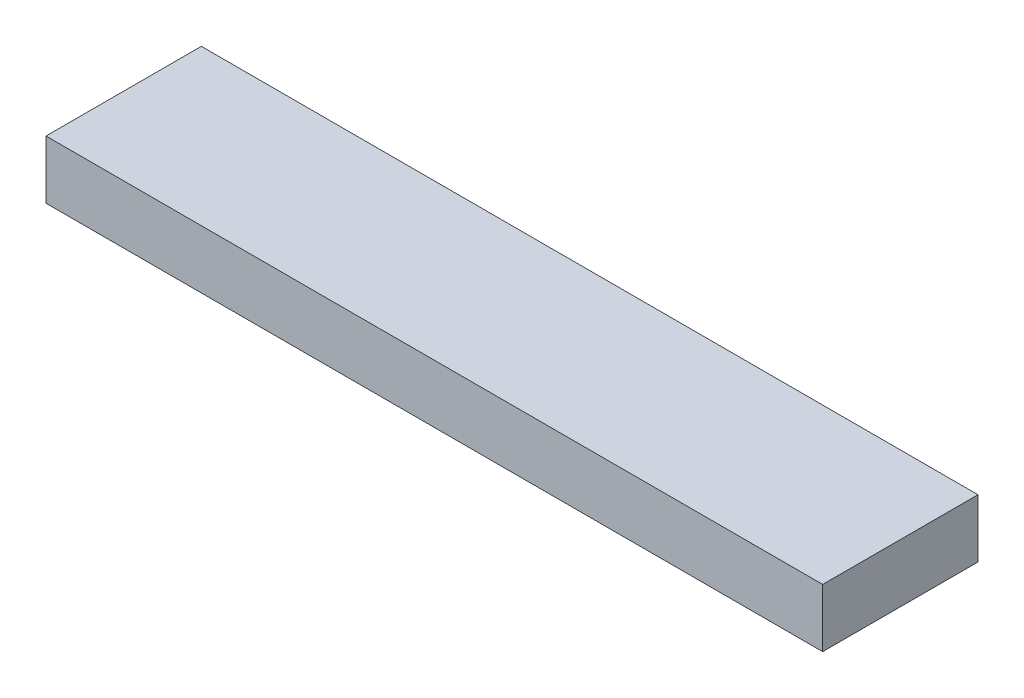
ISO-10303-21;
HEADER;
FILE_DESCRIPTION(('STEP AP214'),'2;1');
FILE_NAME('part.step','',(''),(''),'','','');
FILE_SCHEMA(('AUTOMOTIVE_DESIGN { 1 0 10303 214 1 1 1 1 }'));
ENDSEC;
DATA;
#1=APPLICATION_CONTEXT('core data for automotive mechanical design processes');
#2=APPLICATION_PROTOCOL_DEFINITION('international standard','automotive_design',2000,#1);
#3=PRODUCT_CONTEXT('',#1,'mechanical');
#4=PRODUCT('Part','Part','',(#3));
#5=PRODUCT_RELATED_PRODUCT_CATEGORY('part','',(#4));
#6=PRODUCT_DEFINITION_FORMATION('','',#4);
#7=PRODUCT_DEFINITION_CONTEXT('part definition',#1,'design');
#8=PRODUCT_DEFINITION('design','',#6,#7);
#9=PRODUCT_DEFINITION_SHAPE('','',#8);
#10=(LENGTH_UNIT() NAMED_UNIT(*) SI_UNIT(.MILLI.,.METRE.));
#11=(NAMED_UNIT(*) PLANE_ANGLE_UNIT() SI_UNIT($,.RADIAN.));
#12=(NAMED_UNIT(*) SI_UNIT($,.STERADIAN.) SOLID_ANGLE_UNIT());
#13=UNCERTAINTY_MEASURE_WITH_UNIT(LENGTH_MEASURE(1.E-05),#10,'distance_accuracy_value','');
#14=(GEOMETRIC_REPRESENTATION_CONTEXT(3) GLOBAL_UNCERTAINTY_ASSIGNED_CONTEXT((#13)) GLOBAL_UNIT_ASSIGNED_CONTEXT((#10,
#11,#12)) REPRESENTATION_CONTEXT('',''));
#15=CARTESIAN_POINT('',(0.,0.,0.));
#16=DIRECTION('',(0.,0.,1.));
#17=DIRECTION('',(1.,0.,0.));
#18=AXIS2_PLACEMENT_3D('',#15,#16,#17);
#19=CARTESIAN_POINT('',(-20.,3.,4.));
#20=DIRECTION('',(1.,0.,0.));
#21=DIRECTION('',(0.,0.,-1.));
#22=AXIS2_PLACEMENT_3D('',#19,#20,#21);
#23=PLANE('',#22);
#24=DIRECTION('',(0.,0.,1.));
#25=VECTOR('',#24,1.);
#26=CARTESIAN_POINT('',(-20.,0.,4.));
#27=LINE('',#26,#25);
#28=CARTESIAN_POINT('',(-20.,0.,-4.));
#29=VERTEX_POINT('',#28);
#30=CARTESIAN_POINT('',(-20.,0.,4.));
#31=VERTEX_POINT('',#30);
#32=EDGE_CURVE('E111',#29,#31,#27,.T.);
#33=ORIENTED_EDGE('',*,*,#32,.T.);
#34=DIRECTION('',(0.,-1.,0.));
#35=VECTOR('',#34,1.);
#36=CARTESIAN_POINT('',(-20.,3.,4.));
#37=LINE('',#36,#35);
#38=CARTESIAN_POINT('',(-20.,3.,4.));
#39=VERTEX_POINT('',#38);
#40=EDGE_CURVE('E11',#39,#31,#37,.T.);
#41=ORIENTED_EDGE('',*,*,#40,.F.);
#42=DIRECTION('',(0.,0.,1.));
#43=VECTOR('',#42,1.);
#44=CARTESIAN_POINT('',(-20.,3.,4.));
#45=LINE('',#44,#43);
#46=CARTESIAN_POINT('',(-20.,3.,-4.));
#47=VERTEX_POINT('',#46);
#48=EDGE_CURVE('E95',#47,#39,#45,.T.);
#49=ORIENTED_EDGE('',*,*,#48,.F.);
#50=DIRECTION('',(0.,-1.,0.));
#51=VECTOR('',#50,1.);
#52=CARTESIAN_POINT('',(-20.,3.,-4.));
#53=LINE('',#52,#51);
#54=EDGE_CURVE('E107',#47,#29,#53,.T.);
#55=ORIENTED_EDGE('',*,*,#54,.T.);
#56=EDGE_LOOP('',(#33,#41,#49,#55));
#57=FACE_BOUND('',#56,.T.);
#58=ADVANCED_FACE('F43',(#57),#23,.F.);
#59=CARTESIAN_POINT('',(20.,3.,4.));
#60=DIRECTION('',(0.,0.,-1.));
#61=DIRECTION('',(-1.,0.,0.));
#62=AXIS2_PLACEMENT_3D('',#59,#60,#61);
#63=PLANE('',#62);
#64=DIRECTION('',(1.,0.,0.));
#65=VECTOR('',#64,1.);
#66=CARTESIAN_POINT('',(20.,0.,4.));
#67=LINE('',#66,#65);
#68=CARTESIAN_POINT('',(20.,0.,4.));
#69=VERTEX_POINT('',#68);
#70=EDGE_CURVE('E100',#31,#69,#67,.T.);
#71=ORIENTED_EDGE('',*,*,#70,.T.);
#72=DIRECTION('',(0.,-1.,0.));
#73=VECTOR('',#72,1.);
#74=CARTESIAN_POINT('',(20.,3.,4.));
#75=LINE('',#74,#73);
#76=CARTESIAN_POINT('',(20.,3.,4.));
#77=VERTEX_POINT('',#76);
#78=EDGE_CURVE('E52',#77,#69,#75,.T.);
#79=ORIENTED_EDGE('',*,*,#78,.F.);
#80=DIRECTION('',(1.,0.,0.));
#81=VECTOR('',#80,1.);
#82=CARTESIAN_POINT('',(20.,3.,4.));
#83=LINE('',#82,#81);
#84=EDGE_CURVE('E90',#39,#77,#83,.T.);
#85=ORIENTED_EDGE('',*,*,#84,.F.);
#86=ORIENTED_EDGE('',*,*,#40,.T.);
#87=EDGE_LOOP('',(#71,#79,#85,#86));
#88=FACE_BOUND('',#87,.T.);
#89=ADVANCED_FACE('F99',(#88),#63,.F.);
#90=CARTESIAN_POINT('',(20.,3.,4.));
#91=DIRECTION('',(-1.,0.,0.));
#92=DIRECTION('',(0.,0.,1.));
#93=AXIS2_PLACEMENT_3D('',#90,#91,#92);
#94=PLANE('',#93);
#95=DIRECTION('',(0.,0.,-1.));
#96=VECTOR('',#95,1.);
#97=CARTESIAN_POINT('',(20.,0.,4.));
#98=LINE('',#97,#96);
#99=CARTESIAN_POINT('',(20.,0.,-4.));
#100=VERTEX_POINT('',#99);
#101=EDGE_CURVE('E77',#69,#100,#98,.T.);
#102=ORIENTED_EDGE('',*,*,#101,.T.);
#103=DIRECTION('',(0.,-1.,0.));
#104=VECTOR('',#103,1.);
#105=CARTESIAN_POINT('',(20.,3.,-4.));
#106=LINE('',#105,#104);
#107=CARTESIAN_POINT('',(20.,3.,-4.));
#108=VERTEX_POINT('',#107);
#109=EDGE_CURVE('E102',#108,#100,#106,.T.);
#110=ORIENTED_EDGE('',*,*,#109,.F.);
#111=DIRECTION('',(0.,0.,-1.));
#112=VECTOR('',#111,1.);
#113=CARTESIAN_POINT('',(20.,3.,4.));
#114=LINE('',#113,#112);
#115=EDGE_CURVE('E93',#77,#108,#114,.T.);
#116=ORIENTED_EDGE('',*,*,#115,.F.);
#117=ORIENTED_EDGE('',*,*,#78,.T.);
#118=EDGE_LOOP('',(#102,#110,#116,#117));
#119=FACE_BOUND('',#118,.T.);
#120=ADVANCED_FACE('F103',(#119),#94,.F.);
#121=CARTESIAN_POINT('',(20.,3.,-4.));
#122=DIRECTION('',(0.,0.,1.));
#123=DIRECTION('',(1.,0.,0.));
#124=AXIS2_PLACEMENT_3D('',#121,#122,#123);
#125=PLANE('',#124);
#126=DIRECTION('',(-1.,0.,0.));
#127=VECTOR('',#126,1.);
#128=CARTESIAN_POINT('',(20.,0.,-4.));
#129=LINE('',#128,#127);
#130=EDGE_CURVE('E83',#100,#29,#129,.T.);
#131=ORIENTED_EDGE('',*,*,#130,.T.);
#132=ORIENTED_EDGE('',*,*,#54,.F.);
#133=DIRECTION('',(-1.,0.,0.));
#134=VECTOR('',#133,1.);
#135=CARTESIAN_POINT('',(20.,3.,-4.));
#136=LINE('',#135,#134);
#137=EDGE_CURVE('E60',#108,#47,#136,.T.);
#138=ORIENTED_EDGE('',*,*,#137,.F.);
#139=ORIENTED_EDGE('',*,*,#109,.T.);
#140=EDGE_LOOP('',(#131,#132,#138,#139));
#141=FACE_BOUND('',#140,.T.);
#142=ADVANCED_FACE('F124',(#141),#125,.F.);
#143=CARTESIAN_POINT('',(0.,3.,0.));
#144=DIRECTION('',(0.,1.,0.));
#145=DIRECTION('',(0.,0.,1.));
#146=AXIS2_PLACEMENT_3D('',#143,#144,#145);
#147=PLANE('',#146);
#148=ORIENTED_EDGE('',*,*,#48,.T.);
#149=ORIENTED_EDGE('',*,*,#84,.T.);
#150=ORIENTED_EDGE('',*,*,#115,.T.);
#151=ORIENTED_EDGE('',*,*,#137,.T.);
#152=EDGE_LOOP('',(#148,#149,#150,#151));
#153=FACE_BOUND('',#152,.T.);
#154=ADVANCED_FACE('F91',(#153),#147,.T.);
#155=CARTESIAN_POINT('',(0.,0.,0.));
#156=DIRECTION('',(0.,1.,0.));
#157=DIRECTION('',(0.,0.,1.));
#158=AXIS2_PLACEMENT_3D('',#155,#156,#157);
#159=PLANE('',#158);
#160=ORIENTED_EDGE('',*,*,#32,.F.);
#161=ORIENTED_EDGE('',*,*,#130,.F.);
#162=ORIENTED_EDGE('',*,*,#101,.F.);
#163=ORIENTED_EDGE('',*,*,#70,.F.);
#164=EDGE_LOOP('',(#160,#161,#162,#163));
#165=FACE_BOUND('',#164,.T.);
#166=ADVANCED_FACE('F127',(#165),#159,.F.);
#167=CLOSED_SHELL('',(#58,#89,#120,#142,#154,#166));
#168=MANIFOLD_SOLID_BREP('B2',#167);
#169=ADVANCED_BREP_SHAPE_REPRESENTATION('',(#18,#168),#14);
#170=SHAPE_DEFINITION_REPRESENTATION(#9,#169);
ENDSEC;
END-ISO-10303-21;
